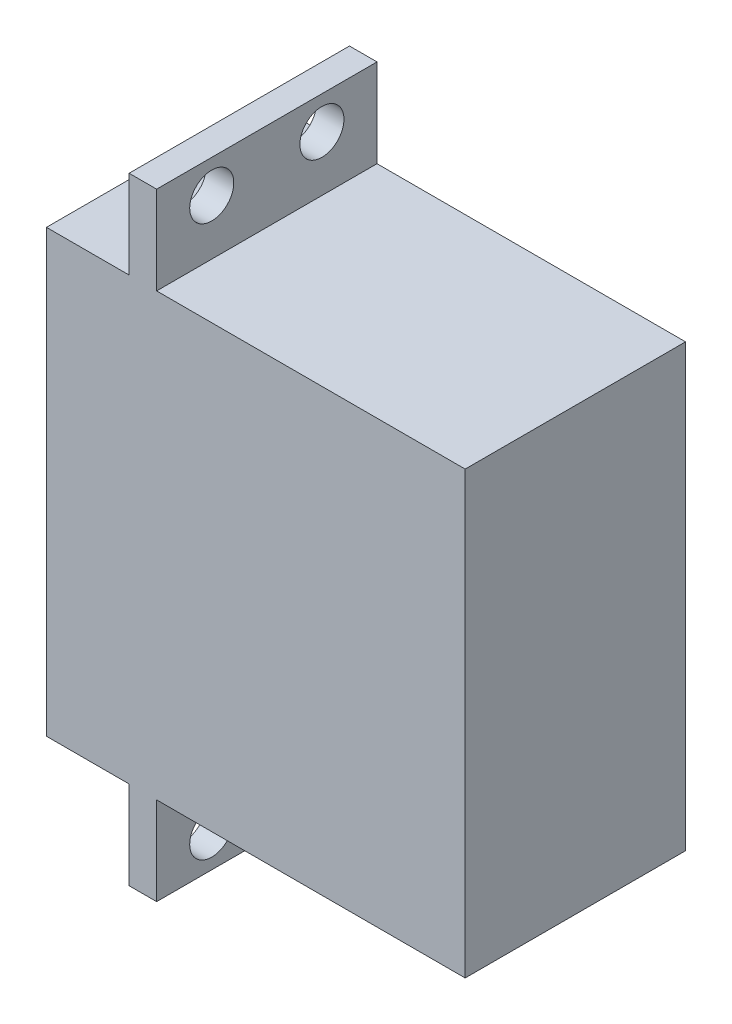
ISO-10303-21;
HEADER;
FILE_DESCRIPTION(('STEP AP214'),'2;1');
FILE_NAME('part.step','',(''),(''),'','','');
FILE_SCHEMA(('AUTOMOTIVE_DESIGN { 1 0 10303 214 1 1 1 1 }'));
ENDSEC;
DATA;
#1=APPLICATION_CONTEXT('core data for automotive mechanical design processes');
#2=APPLICATION_PROTOCOL_DEFINITION('international standard','automotive_design',2000,#1);
#3=PRODUCT_CONTEXT('',#1,'mechanical');
#4=PRODUCT('Part','Part','',(#3));
#5=PRODUCT_RELATED_PRODUCT_CATEGORY('part','',(#4));
#6=PRODUCT_DEFINITION_FORMATION('','',#4);
#7=PRODUCT_DEFINITION_CONTEXT('part definition',#1,'design');
#8=PRODUCT_DEFINITION('design','',#6,#7);
#9=PRODUCT_DEFINITION_SHAPE('','',#8);
#10=(LENGTH_UNIT() NAMED_UNIT(*) SI_UNIT(.MILLI.,.METRE.));
#11=(NAMED_UNIT(*) PLANE_ANGLE_UNIT() SI_UNIT($,.RADIAN.));
#12=(NAMED_UNIT(*) SI_UNIT($,.STERADIAN.) SOLID_ANGLE_UNIT());
#13=UNCERTAINTY_MEASURE_WITH_UNIT(LENGTH_MEASURE(1.E-05),#10,'distance_accuracy_value','');
#14=(GEOMETRIC_REPRESENTATION_CONTEXT(3) GLOBAL_UNCERTAINTY_ASSIGNED_CONTEXT((#13)) GLOBAL_UNIT_ASSIGNED_CONTEXT((#10,
#11,#12)) REPRESENTATION_CONTEXT('',''));
#15=CARTESIAN_POINT('',(0.,0.,0.));
#16=DIRECTION('',(0.,0.,1.));
#17=DIRECTION('',(1.,0.,0.));
#18=AXIS2_PLACEMENT_3D('',#15,#16,#17);
#19=CARTESIAN_POINT('',(-6.,10.,10.));
#20=DIRECTION('',(-1.,0.,0.));
#21=DIRECTION('',(0.,0.,1.));
#22=AXIS2_PLACEMENT_3D('',#19,#20,#21);
#23=PLANE('',#22);
#24=CARTESIAN_POINT('',(-6.,10.,10.));
#25=DIRECTION('',(1.,0.,0.));
#26=DIRECTION('',(0.,0.,-1.));
#27=AXIS2_PLACEMENT_3D('',#24,#25,#26);
#28=CIRCLE('',#27,3.);
#29=CARTESIAN_POINT('',(-6.,10.,7.));
#30=VERTEX_POINT('',#29);
#31=EDGE_CURVE('E20',#30,#30,#28,.T.);
#32=ORIENTED_EDGE('',*,*,#31,.F.);
#33=EDGE_LOOP('',(#32));
#34=FACE_BOUND('',#33,.T.);
#35=ADVANCED_FACE('F17',(#34),#23,.T.);
#36=CARTESIAN_POINT('',(-6.,10.,10.));
#37=DIRECTION('',(1.,0.,0.));
#38=DIRECTION('',(0.,0.,-1.));
#39=AXIS2_PLACEMENT_3D('',#36,#37,#38);
#40=CYLINDRICAL_SURFACE('',#39,3.);
#41=CARTESIAN_POINT('',(-2.,10.,10.));
#42=DIRECTION('',(1.,0.,0.));
#43=DIRECTION('',(0.,0.,-1.));
#44=AXIS2_PLACEMENT_3D('',#41,#42,#43);
#45=CIRCLE('',#44,3.);
#46=CARTESIAN_POINT('',(-2.,10.,7.));
#47=VERTEX_POINT('',#46);
#48=EDGE_CURVE('E168',#47,#47,#45,.T.);
#49=ORIENTED_EDGE('',*,*,#48,.F.);
#50=EDGE_LOOP('',(#49));
#51=FACE_BOUND('',#50,.T.);
#52=ORIENTED_EDGE('',*,*,#31,.T.);
#53=EDGE_LOOP('',(#52));
#54=FACE_BOUND('',#53,.T.);
#55=ADVANCED_FACE('F175',(#51,#54),#40,.T.);
#56=CARTESIAN_POINT('',(-2.,10.,10.));
#57=DIRECTION('',(-1.,0.,0.));
#58=DIRECTION('',(0.,0.,1.));
#59=AXIS2_PLACEMENT_3D('',#56,#57,#58);
#60=PLANE('',#59);
#61=ORIENTED_EDGE('',*,*,#48,.T.);
#62=EDGE_LOOP('',(#61));
#63=FACE_BOUND('',#62,.T.);
#64=CARTESIAN_POINT('',(-2.00000000000955,10.,10.));
#65=DIRECTION('',(1.,0.,0.));
#66=DIRECTION('',(0.,0.,-1.));
#67=AXIS2_PLACEMENT_3D('',#64,#65,#66);
#68=CIRCLE('',#67,4.9999999999477);
#69=CARTESIAN_POINT('',(-2.00000000000955,10.,5.0000000000523));
#70=VERTEX_POINT('',#69);
#71=EDGE_CURVE('E118',#70,#70,#68,.T.);
#72=ORIENTED_EDGE('',*,*,#71,.F.);
#73=EDGE_LOOP('',(#72));
#74=FACE_BOUND('',#73,.T.);
#75=ADVANCED_FACE('F182',(#63,#74),#60,.T.);
#76=CARTESIAN_POINT('',(11.5,-5.,15.0000000000005));
#77=DIRECTION('',(-1.,0.,0.));
#78=DIRECTION('',(0.,0.,1.));
#79=AXIS2_PLACEMENT_3D('',#76,#77,#78);
#80=CYLINDRICAL_SURFACE('',#79,2.);
#81=CARTESIAN_POINT('',(10.,-5.,15.0000000000005));
#82=DIRECTION('',(-1.,0.,0.));
#83=DIRECTION('',(0.,0.,1.));
#84=AXIS2_PLACEMENT_3D('',#81,#82,#83);
#85=CIRCLE('',#84,2.);
#86=CARTESIAN_POINT('',(10.,-5.,17.0000000000005));
#87=VERTEX_POINT('',#86);
#88=EDGE_CURVE('E162',#87,#87,#85,.T.);
#89=ORIENTED_EDGE('',*,*,#88,.F.);
#90=EDGE_LOOP('',(#89));
#91=FACE_BOUND('',#90,.T.);
#92=CARTESIAN_POINT('',(7.50000000000001,-5.,15.0000000000005));
#93=DIRECTION('',(-1.,0.,0.));
#94=DIRECTION('',(0.,0.,1.));
#95=AXIS2_PLACEMENT_3D('',#92,#93,#94);
#96=CIRCLE('',#95,2.);
#97=CARTESIAN_POINT('',(7.50000000000001,-5.,17.0000000000005));
#98=VERTEX_POINT('',#97);
#99=EDGE_CURVE('E117',#98,#98,#96,.T.);
#100=ORIENTED_EDGE('',*,*,#99,.T.);
#101=EDGE_LOOP('',(#100));
#102=FACE_BOUND('',#101,.T.);
#103=ADVANCED_FACE('F252',(#91,#102),#80,.F.);
#104=CARTESIAN_POINT('',(11.5,-5.,4.99999999999948));
#105=DIRECTION('',(-1.,0.,0.));
#106=DIRECTION('',(0.,0.,1.));
#107=AXIS2_PLACEMENT_3D('',#104,#105,#106);
#108=CYLINDRICAL_SURFACE('',#107,2.000000000001);
#109=CARTESIAN_POINT('',(10.,-5.,4.99999999999948));
#110=DIRECTION('',(-1.,0.,0.));
#111=DIRECTION('',(0.,0.,1.));
#112=AXIS2_PLACEMENT_3D('',#109,#110,#111);
#113=CIRCLE('',#112,2.000000000001);
#114=CARTESIAN_POINT('',(10.,-5.,7.00000000000047));
#115=VERTEX_POINT('',#114);
#116=EDGE_CURVE('E158',#115,#115,#113,.T.);
#117=ORIENTED_EDGE('',*,*,#116,.F.);
#118=EDGE_LOOP('',(#117));
#119=FACE_BOUND('',#118,.T.);
#120=CARTESIAN_POINT('',(7.50000000000001,-5.,4.99999999999948));
#121=DIRECTION('',(-1.,0.,0.));
#122=DIRECTION('',(0.,0.,1.));
#123=AXIS2_PLACEMENT_3D('',#120,#121,#122);
#124=CIRCLE('',#123,2.000000000001);
#125=CARTESIAN_POINT('',(7.50000000000001,-5.,7.00000000000047));
#126=VERTEX_POINT('',#125);
#127=EDGE_CURVE('E131',#126,#126,#124,.T.);
#128=ORIENTED_EDGE('',*,*,#127,.T.);
#129=EDGE_LOOP('',(#128));
#130=FACE_BOUND('',#129,.T.);
#131=ADVANCED_FACE('F248',(#119,#130),#108,.F.);
#132=CARTESIAN_POINT('',(11.5,45.,15.));
#133=DIRECTION('',(-1.,0.,0.));
#134=DIRECTION('',(0.,0.,1.));
#135=AXIS2_PLACEMENT_3D('',#132,#133,#134);
#136=CYLINDRICAL_SURFACE('',#135,2.);
#137=CARTESIAN_POINT('',(10.,45.,15.));
#138=DIRECTION('',(-1.,0.,0.));
#139=DIRECTION('',(0.,0.,1.));
#140=AXIS2_PLACEMENT_3D('',#137,#138,#139);
#141=CIRCLE('',#140,2.);
#142=CARTESIAN_POINT('',(10.,45.,17.));
#143=VERTEX_POINT('',#142);
#144=EDGE_CURVE('E154',#143,#143,#141,.T.);
#145=ORIENTED_EDGE('',*,*,#144,.F.);
#146=EDGE_LOOP('',(#145));
#147=FACE_BOUND('',#146,.T.);
#148=CARTESIAN_POINT('',(7.50000000000001,45.,15.));
#149=DIRECTION('',(-1.,0.,0.));
#150=DIRECTION('',(0.,0.,1.));
#151=AXIS2_PLACEMENT_3D('',#148,#149,#150);
#152=CIRCLE('',#151,2.);
#153=CARTESIAN_POINT('',(7.50000000000001,45.,17.));
#154=VERTEX_POINT('',#153);
#155=EDGE_CURVE('E146',#154,#154,#152,.T.);
#156=ORIENTED_EDGE('',*,*,#155,.T.);
#157=EDGE_LOOP('',(#156));
#158=FACE_BOUND('',#157,.T.);
#159=ADVANCED_FACE('F244',(#147,#158),#136,.F.);
#160=CARTESIAN_POINT('',(11.5,45.,4.99999999999999));
#161=DIRECTION('',(-1.,0.,0.));
#162=DIRECTION('',(0.,0.,1.));
#163=AXIS2_PLACEMENT_3D('',#160,#161,#162);
#164=CYLINDRICAL_SURFACE('',#163,2.);
#165=CARTESIAN_POINT('',(10.,45.,4.99999999999999));
#166=DIRECTION('',(-1.,0.,0.));
#167=DIRECTION('',(0.,0.,1.));
#168=AXIS2_PLACEMENT_3D('',#165,#166,#167);
#169=CIRCLE('',#168,2.);
#170=CARTESIAN_POINT('',(10.,45.,7.));
#171=VERTEX_POINT('',#170);
#172=EDGE_CURVE('E150',#171,#171,#169,.T.);
#173=ORIENTED_EDGE('',*,*,#172,.F.);
#174=EDGE_LOOP('',(#173));
#175=FACE_BOUND('',#174,.T.);
#176=CARTESIAN_POINT('',(7.50000000000001,45.,4.99999999999999));
#177=DIRECTION('',(-1.,0.,0.));
#178=DIRECTION('',(0.,0.,1.));
#179=AXIS2_PLACEMENT_3D('',#176,#177,#178);
#180=CIRCLE('',#179,2.);
#181=CARTESIAN_POINT('',(7.50000000000001,45.,7.));
#182=VERTEX_POINT('',#181);
#183=EDGE_CURVE('E142',#182,#182,#180,.T.);
#184=ORIENTED_EDGE('',*,*,#183,.T.);
#185=EDGE_LOOP('',(#184));
#186=FACE_BOUND('',#185,.T.);
#187=ADVANCED_FACE('F240',(#175,#186),#164,.F.);
#188=CARTESIAN_POINT('',(0.,10.,10.));
#189=DIRECTION('',(1.,0.,0.));
#190=DIRECTION('',(0.,0.,-1.));
#191=AXIS2_PLACEMENT_3D('',#188,#189,#190);
#192=CONICAL_SURFACE('',#191,6.99999999995725,0.785398163397448);
#193=CARTESIAN_POINT('',(0.,10.,10.));
#194=DIRECTION('',(1.,0.,0.));
#195=DIRECTION('',(0.,0.,-1.));
#196=AXIS2_PLACEMENT_3D('',#193,#194,#195);
#197=CIRCLE('',#196,6.99999999995725);
#198=CARTESIAN_POINT('',(0.,10.,3.00000000004275));
#199=VERTEX_POINT('',#198);
#200=EDGE_CURVE('E137',#199,#199,#197,.T.);
#201=ORIENTED_EDGE('',*,*,#200,.F.);
#202=EDGE_LOOP('',(#201));
#203=FACE_BOUND('',#202,.T.);
#204=ORIENTED_EDGE('',*,*,#71,.T.);
#205=EDGE_LOOP('',(#204));
#206=FACE_BOUND('',#205,.T.);
#207=ADVANCED_FACE('F237',(#203,#206),#192,.T.);
#208=CARTESIAN_POINT('',(0.,0.,0.));
#209=DIRECTION('',(0.,0.,1.));
#210=DIRECTION('',(1.,0.,0.));
#211=AXIS2_PLACEMENT_3D('',#208,#209,#210);
#212=PLANE('',#211);
#213=DIRECTION('',(0.,1.,0.));
#214=VECTOR('',#213,1.);
#215=CARTESIAN_POINT('',(0.,0.,0.));
#216=LINE('',#215,#214);
#217=CARTESIAN_POINT('',(0.,40.,0.));
#218=VERTEX_POINT('',#217);
#219=CARTESIAN_POINT('',(0.,0.,0.));
#220=VERTEX_POINT('',#219);
#221=EDGE_CURVE('E140',#218,#220,#216,.F.);
#222=ORIENTED_EDGE('',*,*,#221,.F.);
#223=DIRECTION('',(1.,0.,0.));
#224=VECTOR('',#223,1.);
#225=CARTESIAN_POINT('',(0.,40.,0.));
#226=LINE('',#225,#224);
#227=CARTESIAN_POINT('',(7.50000000000001,40.,0.));
#228=VERTEX_POINT('',#227);
#229=EDGE_CURVE('E443',#228,#218,#226,.F.);
#230=ORIENTED_EDGE('',*,*,#229,.F.);
#231=DIRECTION('',(0.,1.,0.));
#232=VECTOR('',#231,1.);
#233=CARTESIAN_POINT('',(7.50000000000001,0.,0.));
#234=LINE('',#233,#232);
#235=CARTESIAN_POINT('',(7.50000000000001,48.,0.));
#236=VERTEX_POINT('',#235);
#237=EDGE_CURVE('E445',#228,#236,#234,.T.);
#238=ORIENTED_EDGE('',*,*,#237,.T.);
#239=DIRECTION('',(-1.,0.,0.));
#240=VECTOR('',#239,1.);
#241=CARTESIAN_POINT('',(-1.33226762955019E-13,48.,0.));
#242=LINE('',#241,#240);
#243=CARTESIAN_POINT('',(10.,48.,0.));
#244=VERTEX_POINT('',#243);
#245=EDGE_CURVE('E451',#244,#236,#242,.T.);
#246=ORIENTED_EDGE('',*,*,#245,.F.);
#247=DIRECTION('',(0.,1.,0.));
#248=VECTOR('',#247,1.);
#249=CARTESIAN_POINT('',(10.,0.,0.));
#250=LINE('',#249,#248);
#251=CARTESIAN_POINT('',(10.,40.,0.));
#252=VERTEX_POINT('',#251);
#253=EDGE_CURVE('E153',#252,#244,#250,.T.);
#254=ORIENTED_EDGE('',*,*,#253,.F.);
#255=DIRECTION('',(1.,0.,0.));
#256=VECTOR('',#255,1.);
#257=CARTESIAN_POINT('',(0.,40.,0.));
#258=LINE('',#257,#256);
#259=CARTESIAN_POINT('',(38.,40.,0.));
#260=VERTEX_POINT('',#259);
#261=EDGE_CURVE('E460',#260,#252,#258,.F.);
#262=ORIENTED_EDGE('',*,*,#261,.F.);
#263=DIRECTION('',(0.,1.,0.));
#264=VECTOR('',#263,1.);
#265=CARTESIAN_POINT('',(38.,0.,0.));
#266=LINE('',#265,#264);
#267=CARTESIAN_POINT('',(38.,0.,0.));
#268=VERTEX_POINT('',#267);
#269=EDGE_CURVE('E463',#260,#268,#266,.F.);
#270=ORIENTED_EDGE('',*,*,#269,.T.);
#271=DIRECTION('',(1.,0.,0.));
#272=VECTOR('',#271,1.);
#273=CARTESIAN_POINT('',(0.,0.,0.));
#274=LINE('',#273,#272);
#275=CARTESIAN_POINT('',(10.,0.,0.));
#276=VERTEX_POINT('',#275);
#277=EDGE_CURVE('E468',#268,#276,#274,.F.);
#278=ORIENTED_EDGE('',*,*,#277,.T.);
#279=DIRECTION('',(0.,1.,0.));
#280=VECTOR('',#279,1.);
#281=CARTESIAN_POINT('',(10.,0.,0.));
#282=LINE('',#281,#280);
#283=CARTESIAN_POINT('',(10.,-8.,0.));
#284=VERTEX_POINT('',#283);
#285=EDGE_CURVE('E161',#284,#276,#282,.T.);
#286=ORIENTED_EDGE('',*,*,#285,.F.);
#287=DIRECTION('',(-1.,0.,0.));
#288=VECTOR('',#287,1.);
#289=CARTESIAN_POINT('',(0.,-7.99999999999997,0.));
#290=LINE('',#289,#288);
#291=CARTESIAN_POINT('',(7.50000000000001,-7.99999999999999,0.));
#292=VERTEX_POINT('',#291);
#293=EDGE_CURVE('E122',#284,#292,#290,.T.);
#294=ORIENTED_EDGE('',*,*,#293,.T.);
#295=DIRECTION('',(0.,1.,0.));
#296=VECTOR('',#295,1.);
#297=CARTESIAN_POINT('',(7.50000000000001,0.,0.));
#298=LINE('',#297,#296);
#299=CARTESIAN_POINT('',(7.50000000000001,0.,0.));
#300=VERTEX_POINT('',#299);
#301=EDGE_CURVE('E104',#292,#300,#298,.T.);
#302=ORIENTED_EDGE('',*,*,#301,.T.);
#303=DIRECTION('',(1.,0.,0.));
#304=VECTOR('',#303,1.);
#305=CARTESIAN_POINT('',(0.,0.,0.));
#306=LINE('',#305,#304);
#307=EDGE_CURVE('E109',#300,#220,#306,.F.);
#308=ORIENTED_EDGE('',*,*,#307,.T.);
#309=EDGE_LOOP('',(#222,#230,#238,#246,#254,#262,#270,#278,#286,#294,#302,#308));
#310=FACE_BOUND('',#309,.T.);
#311=ADVANCED_FACE('F120',(#310),#212,.F.);
#312=CARTESIAN_POINT('',(0.,0.,20.));
#313=DIRECTION('',(0.,1.,0.));
#314=DIRECTION('',(0.,0.,1.));
#315=AXIS2_PLACEMENT_3D('',#312,#313,#314);
#316=PLANE('',#315);
#317=DIRECTION('',(0.,0.,-1.));
#318=VECTOR('',#317,1.);
#319=CARTESIAN_POINT('',(7.50000000000001,0.,20.));
#320=LINE('',#319,#318);
#321=CARTESIAN_POINT('',(7.50000000000001,0.,20.));
#322=VERTEX_POINT('',#321);
#323=EDGE_CURVE('E111',#300,#322,#320,.F.);
#324=ORIENTED_EDGE('',*,*,#323,.T.);
#325=DIRECTION('',(1.,0.,0.));
#326=VECTOR('',#325,1.);
#327=CARTESIAN_POINT('',(0.,0.,20.));
#328=LINE('',#327,#326);
#329=CARTESIAN_POINT('',(0.,0.,20.));
#330=VERTEX_POINT('',#329);
#331=EDGE_CURVE('E433',#330,#322,#328,.T.);
#332=ORIENTED_EDGE('',*,*,#331,.F.);
#333=DIRECTION('',(0.,0.,1.));
#334=VECTOR('',#333,1.);
#335=CARTESIAN_POINT('',(0.,0.,20.));
#336=LINE('',#335,#334);
#337=EDGE_CURVE('E114',#220,#330,#336,.T.);
#338=ORIENTED_EDGE('',*,*,#337,.F.);
#339=ORIENTED_EDGE('',*,*,#307,.F.);
#340=EDGE_LOOP('',(#324,#332,#338,#339));
#341=FACE_BOUND('',#340,.T.);
#342=ADVANCED_FACE('F110',(#341),#316,.F.);
#343=CARTESIAN_POINT('',(7.50000000000001,0.,20.));
#344=DIRECTION('',(1.,0.,0.));
#345=DIRECTION('',(0.,0.,-1.));
#346=AXIS2_PLACEMENT_3D('',#343,#344,#345);
#347=PLANE('',#346);
#348=DIRECTION('',(0.,0.,1.));
#349=VECTOR('',#348,1.);
#350=CARTESIAN_POINT('',(7.50000000000001,-7.99999999999999,20.));
#351=LINE('',#350,#349);
#352=CARTESIAN_POINT('',(7.50000000000001,-7.99999999999999,20.));
#353=VERTEX_POINT('',#352);
#354=EDGE_CURVE('E124',#292,#353,#351,.T.);
#355=ORIENTED_EDGE('',*,*,#354,.T.);
#356=DIRECTION('',(0.,1.,0.));
#357=VECTOR('',#356,1.);
#358=CARTESIAN_POINT('',(7.50000000000001,0.,20.));
#359=LINE('',#358,#357);
#360=EDGE_CURVE('E129',#322,#353,#359,.F.);
#361=ORIENTED_EDGE('',*,*,#360,.F.);
#362=ORIENTED_EDGE('',*,*,#323,.F.);
#363=ORIENTED_EDGE('',*,*,#301,.F.);
#364=EDGE_LOOP('',(#355,#361,#362,#363));
#365=FACE_BOUND('',#364,.T.);
#366=ORIENTED_EDGE('',*,*,#127,.F.);
#367=EDGE_LOOP('',(#366));
#368=FACE_BOUND('',#367,.T.);
#369=ORIENTED_EDGE('',*,*,#99,.F.);
#370=EDGE_LOOP('',(#369));
#371=FACE_BOUND('',#370,.T.);
#372=ADVANCED_FACE('F126',(#365,#368,#371),#347,.F.);
#373=CARTESIAN_POINT('',(0.,-7.99999999999997,20.));
#374=DIRECTION('',(0.,1.,0.));
#375=DIRECTION('',(-1.,0.,0.));
#376=AXIS2_PLACEMENT_3D('',#373,#374,#375);
#377=PLANE('',#376);
#378=DIRECTION('',(0.,0.,-1.));
#379=VECTOR('',#378,1.);
#380=CARTESIAN_POINT('',(10.,-8.,20.));
#381=LINE('',#380,#379);
#382=CARTESIAN_POINT('',(10.,-8.,20.));
#383=VERTEX_POINT('',#382);
#384=EDGE_CURVE('E419',#383,#284,#381,.T.);
#385=ORIENTED_EDGE('',*,*,#384,.F.);
#386=DIRECTION('',(1.,0.,0.));
#387=VECTOR('',#386,1.);
#388=CARTESIAN_POINT('',(0.,-7.99999999999999,20.));
#389=LINE('',#388,#387);
#390=EDGE_CURVE('E422',#353,#383,#389,.T.);
#391=ORIENTED_EDGE('',*,*,#390,.F.);
#392=ORIENTED_EDGE('',*,*,#354,.F.);
#393=ORIENTED_EDGE('',*,*,#293,.F.);
#394=EDGE_LOOP('',(#385,#391,#392,#393));
#395=FACE_BOUND('',#394,.T.);
#396=ADVANCED_FACE('F226',(#395),#377,.F.);
#397=CARTESIAN_POINT('',(10.,0.,20.));
#398=DIRECTION('',(1.,0.,0.));
#399=DIRECTION('',(0.,0.,-1.));
#400=AXIS2_PLACEMENT_3D('',#397,#398,#399);
#401=PLANE('',#400);
#402=DIRECTION('',(0.,1.,0.));
#403=VECTOR('',#402,1.);
#404=CARTESIAN_POINT('',(10.,0.,20.));
#405=LINE('',#404,#403);
#406=CARTESIAN_POINT('',(10.,0.,20.));
#407=VERTEX_POINT('',#406);
#408=EDGE_CURVE('E426',#383,#407,#405,.T.);
#409=ORIENTED_EDGE('',*,*,#408,.F.);
#410=ORIENTED_EDGE('',*,*,#384,.T.);
#411=ORIENTED_EDGE('',*,*,#285,.T.);
#412=DIRECTION('',(0.,0.,1.));
#413=VECTOR('',#412,1.);
#414=CARTESIAN_POINT('',(10.,0.,20.));
#415=LINE('',#414,#413);
#416=EDGE_CURVE('E423',#276,#407,#415,.T.);
#417=ORIENTED_EDGE('',*,*,#416,.T.);
#418=EDGE_LOOP('',(#409,#410,#411,#417));
#419=FACE_BOUND('',#418,.T.);
#420=ORIENTED_EDGE('',*,*,#116,.T.);
#421=EDGE_LOOP('',(#420));
#422=FACE_BOUND('',#421,.T.);
#423=ORIENTED_EDGE('',*,*,#88,.T.);
#424=EDGE_LOOP('',(#423));
#425=FACE_BOUND('',#424,.T.);
#426=ADVANCED_FACE('F222',(#419,#422,#425),#401,.T.);
#427=CARTESIAN_POINT('',(0.,0.,20.));
#428=DIRECTION('',(0.,1.,0.));
#429=DIRECTION('',(0.,0.,1.));
#430=AXIS2_PLACEMENT_3D('',#427,#428,#429);
#431=PLANE('',#430);
#432=DIRECTION('',(0.,0.,1.));
#433=VECTOR('',#432,1.);
#434=CARTESIAN_POINT('',(38.,0.,20.));
#435=LINE('',#434,#433);
#436=CARTESIAN_POINT('',(38.,0.,20.));
#437=VERTEX_POINT('',#436);
#438=EDGE_CURVE('E466',#268,#437,#435,.T.);
#439=ORIENTED_EDGE('',*,*,#438,.T.);
#440=DIRECTION('',(1.,0.,0.));
#441=VECTOR('',#440,1.);
#442=CARTESIAN_POINT('',(0.,0.,20.));
#443=LINE('',#442,#441);
#444=EDGE_CURVE('E430',#407,#437,#443,.T.);
#445=ORIENTED_EDGE('',*,*,#444,.F.);
#446=ORIENTED_EDGE('',*,*,#416,.F.);
#447=ORIENTED_EDGE('',*,*,#277,.F.);
#448=EDGE_LOOP('',(#439,#445,#446,#447));
#449=FACE_BOUND('',#448,.T.);
#450=ADVANCED_FACE('F218',(#449),#431,.F.);
#451=CARTESIAN_POINT('',(38.,0.,20.));
#452=DIRECTION('',(-1.,0.,0.));
#453=DIRECTION('',(0.,0.,1.));
#454=AXIS2_PLACEMENT_3D('',#451,#452,#453);
#455=PLANE('',#454);
#456=DIRECTION('',(0.,0.,1.));
#457=VECTOR('',#456,1.);
#458=CARTESIAN_POINT('',(38.,40.,20.));
#459=LINE('',#458,#457);
#460=CARTESIAN_POINT('',(38.,40.,20.));
#461=VERTEX_POINT('',#460);
#462=EDGE_CURVE('E157',#461,#260,#459,.F.);
#463=ORIENTED_EDGE('',*,*,#462,.F.);
#464=DIRECTION('',(0.,1.,0.));
#465=VECTOR('',#464,1.);
#466=CARTESIAN_POINT('',(38.,0.,20.));
#467=LINE('',#466,#465);
#468=EDGE_CURVE('E477',#437,#461,#467,.T.);
#469=ORIENTED_EDGE('',*,*,#468,.F.);
#470=ORIENTED_EDGE('',*,*,#438,.F.);
#471=ORIENTED_EDGE('',*,*,#269,.F.);
#472=EDGE_LOOP('',(#463,#469,#470,#471));
#473=FACE_BOUND('',#472,.T.);
#474=ADVANCED_FACE('F214',(#473),#455,.F.);
#475=CARTESIAN_POINT('',(0.,40.,20.));
#476=DIRECTION('',(0.,1.,0.));
#477=DIRECTION('',(0.,0.,1.));
#478=AXIS2_PLACEMENT_3D('',#475,#476,#477);
#479=PLANE('',#478);
#480=DIRECTION('',(1.,0.,0.));
#481=VECTOR('',#480,1.);
#482=CARTESIAN_POINT('',(0.,40.,20.));
#483=LINE('',#482,#481);
#484=CARTESIAN_POINT('',(10.,40.,20.));
#485=VERTEX_POINT('',#484);
#486=EDGE_CURVE('E478',#461,#485,#483,.F.);
#487=ORIENTED_EDGE('',*,*,#486,.F.);
#488=ORIENTED_EDGE('',*,*,#462,.T.);
#489=ORIENTED_EDGE('',*,*,#261,.T.);
#490=DIRECTION('',(0.,0.,-1.));
#491=VECTOR('',#490,1.);
#492=CARTESIAN_POINT('',(10.,40.,20.));
#493=LINE('',#492,#491);
#494=EDGE_CURVE('E453',#485,#252,#493,.T.);
#495=ORIENTED_EDGE('',*,*,#494,.F.);
#496=EDGE_LOOP('',(#487,#488,#489,#495));
#497=FACE_BOUND('',#496,.T.);
#498=ADVANCED_FACE('F210',(#497),#479,.T.);
#499=CARTESIAN_POINT('',(10.,0.,20.));
#500=DIRECTION('',(1.,0.,0.));
#501=DIRECTION('',(0.,0.,-1.));
#502=AXIS2_PLACEMENT_3D('',#499,#500,#501);
#503=PLANE('',#502);
#504=DIRECTION('',(0.,1.,0.));
#505=VECTOR('',#504,1.);
#506=CARTESIAN_POINT('',(10.,0.,20.));
#507=LINE('',#506,#505);
#508=CARTESIAN_POINT('',(10.,48.,20.));
#509=VERTEX_POINT('',#508);
#510=EDGE_CURVE('E483',#485,#509,#507,.T.);
#511=ORIENTED_EDGE('',*,*,#510,.F.);
#512=ORIENTED_EDGE('',*,*,#494,.T.);
#513=ORIENTED_EDGE('',*,*,#253,.T.);
#514=DIRECTION('',(0.,0.,1.));
#515=VECTOR('',#514,1.);
#516=CARTESIAN_POINT('',(10.,48.,20.));
#517=LINE('',#516,#515);
#518=EDGE_CURVE('E149',#509,#244,#517,.F.);
#519=ORIENTED_EDGE('',*,*,#518,.F.);
#520=EDGE_LOOP('',(#511,#512,#513,#519));
#521=FACE_BOUND('',#520,.T.);
#522=ORIENTED_EDGE('',*,*,#172,.T.);
#523=EDGE_LOOP('',(#522));
#524=FACE_BOUND('',#523,.T.);
#525=ORIENTED_EDGE('',*,*,#144,.T.);
#526=EDGE_LOOP('',(#525));
#527=FACE_BOUND('',#526,.T.);
#528=ADVANCED_FACE('F206',(#521,#524,#527),#503,.T.);
#529=CARTESIAN_POINT('',(-1.33226762955019E-13,48.,20.));
#530=DIRECTION('',(0.,1.,0.));
#531=DIRECTION('',(-1.,0.,0.));
#532=AXIS2_PLACEMENT_3D('',#529,#530,#531);
#533=PLANE('',#532);
#534=DIRECTION('',(1.,0.,0.));
#535=VECTOR('',#534,1.);
#536=CARTESIAN_POINT('',(0.,48.,20.));
#537=LINE('',#536,#535);
#538=CARTESIAN_POINT('',(7.50000000000001,48.,20.));
#539=VERTEX_POINT('',#538);
#540=EDGE_CURVE('E486',#509,#539,#537,.F.);
#541=ORIENTED_EDGE('',*,*,#540,.F.);
#542=ORIENTED_EDGE('',*,*,#518,.T.);
#543=ORIENTED_EDGE('',*,*,#245,.T.);
#544=DIRECTION('',(0.,0.,-1.));
#545=VECTOR('',#544,1.);
#546=CARTESIAN_POINT('',(7.50000000000001,48.,20.));
#547=LINE('',#546,#545);
#548=EDGE_CURVE('E145',#236,#539,#547,.F.);
#549=ORIENTED_EDGE('',*,*,#548,.T.);
#550=EDGE_LOOP('',(#541,#542,#543,#549));
#551=FACE_BOUND('',#550,.T.);
#552=ADVANCED_FACE('F202',(#551),#533,.T.);
#553=CARTESIAN_POINT('',(7.50000000000001,0.,20.));
#554=DIRECTION('',(1.,0.,0.));
#555=DIRECTION('',(0.,0.,-1.));
#556=AXIS2_PLACEMENT_3D('',#553,#554,#555);
#557=PLANE('',#556);
#558=DIRECTION('',(0.,0.,1.));
#559=VECTOR('',#558,1.);
#560=CARTESIAN_POINT('',(7.50000000000001,40.,20.));
#561=LINE('',#560,#559);
#562=CARTESIAN_POINT('',(7.50000000000001,40.,20.));
#563=VERTEX_POINT('',#562);
#564=EDGE_CURVE('E141',#563,#228,#561,.F.);
#565=ORIENTED_EDGE('',*,*,#564,.F.);
#566=DIRECTION('',(0.,1.,0.));
#567=VECTOR('',#566,1.);
#568=CARTESIAN_POINT('',(7.50000000000001,0.,20.));
#569=LINE('',#568,#567);
#570=EDGE_CURVE('E489',#539,#563,#569,.F.);
#571=ORIENTED_EDGE('',*,*,#570,.F.);
#572=ORIENTED_EDGE('',*,*,#548,.F.);
#573=ORIENTED_EDGE('',*,*,#237,.F.);
#574=EDGE_LOOP('',(#565,#571,#572,#573));
#575=FACE_BOUND('',#574,.T.);
#576=ORIENTED_EDGE('',*,*,#183,.F.);
#577=EDGE_LOOP('',(#576));
#578=FACE_BOUND('',#577,.T.);
#579=ORIENTED_EDGE('',*,*,#155,.F.);
#580=EDGE_LOOP('',(#579));
#581=FACE_BOUND('',#580,.T.);
#582=ADVANCED_FACE('F199',(#575,#578,#581),#557,.F.);
#583=CARTESIAN_POINT('',(0.,40.,20.));
#584=DIRECTION('',(0.,1.,0.));
#585=DIRECTION('',(0.,0.,1.));
#586=AXIS2_PLACEMENT_3D('',#583,#584,#585);
#587=PLANE('',#586);
#588=DIRECTION('',(1.,0.,0.));
#589=VECTOR('',#588,1.);
#590=CARTESIAN_POINT('',(0.,40.,20.));
#591=LINE('',#590,#589);
#592=CARTESIAN_POINT('',(0.,40.,20.));
#593=VERTEX_POINT('',#592);
#594=EDGE_CURVE('E26',#563,#593,#591,.F.);
#595=ORIENTED_EDGE('',*,*,#594,.F.);
#596=ORIENTED_EDGE('',*,*,#564,.T.);
#597=ORIENTED_EDGE('',*,*,#229,.T.);
#598=DIRECTION('',(0.,0.,1.));
#599=VECTOR('',#598,1.);
#600=CARTESIAN_POINT('',(0.,40.,20.));
#601=LINE('',#600,#599);
#602=EDGE_CURVE('E35',#593,#218,#601,.F.);
#603=ORIENTED_EDGE('',*,*,#602,.F.);
#604=EDGE_LOOP('',(#595,#596,#597,#603));
#605=FACE_BOUND('',#604,.T.);
#606=ADVANCED_FACE('F192',(#605),#587,.T.);
#607=CARTESIAN_POINT('',(0.,0.,20.));
#608=DIRECTION('',(-1.,0.,0.));
#609=DIRECTION('',(0.,0.,1.));
#610=AXIS2_PLACEMENT_3D('',#607,#608,#609);
#611=PLANE('',#610);
#612=DIRECTION('',(0.,1.,0.));
#613=VECTOR('',#612,1.);
#614=CARTESIAN_POINT('',(0.,0.,20.));
#615=LINE('',#614,#613);
#616=EDGE_CURVE('E11',#593,#330,#615,.F.);
#617=ORIENTED_EDGE('',*,*,#616,.F.);
#618=ORIENTED_EDGE('',*,*,#602,.T.);
#619=ORIENTED_EDGE('',*,*,#221,.T.);
#620=ORIENTED_EDGE('',*,*,#337,.T.);
#621=EDGE_LOOP('',(#617,#618,#619,#620));
#622=FACE_BOUND('',#621,.T.);
#623=ORIENTED_EDGE('',*,*,#200,.T.);
#624=EDGE_LOOP('',(#623));
#625=FACE_BOUND('',#624,.T.);
#626=ADVANCED_FACE('F186',(#622,#625),#611,.T.);
#627=CARTESIAN_POINT('',(0.,0.,20.));
#628=DIRECTION('',(0.,0.,1.));
#629=DIRECTION('',(1.,0.,0.));
#630=AXIS2_PLACEMENT_3D('',#627,#628,#629);
#631=PLANE('',#630);
#632=ORIENTED_EDGE('',*,*,#594,.T.);
#633=ORIENTED_EDGE('',*,*,#616,.T.);
#634=ORIENTED_EDGE('',*,*,#331,.T.);
#635=ORIENTED_EDGE('',*,*,#360,.T.);
#636=ORIENTED_EDGE('',*,*,#390,.T.);
#637=ORIENTED_EDGE('',*,*,#408,.T.);
#638=ORIENTED_EDGE('',*,*,#444,.T.);
#639=ORIENTED_EDGE('',*,*,#468,.T.);
#640=ORIENTED_EDGE('',*,*,#486,.T.);
#641=ORIENTED_EDGE('',*,*,#510,.T.);
#642=ORIENTED_EDGE('',*,*,#540,.T.);
#643=ORIENTED_EDGE('',*,*,#570,.T.);
#644=EDGE_LOOP('',(#632,#633,#634,#635,#636,#637,#638,#639,#640,#641,#642,#643));
#645=FACE_BOUND('',#644,.T.);
#646=ADVANCED_FACE('F184',(#645),#631,.T.);
#647=CLOSED_SHELL('',(#35,#55,#75,#103,#131,#159,#187,#207,#311,#342,#372,#396,#426,#450,#474,
#498,#528,#552,#582,#606,#626,#646));
#648=MANIFOLD_SOLID_BREP('B1',#647);
#649=ADVANCED_BREP_SHAPE_REPRESENTATION('',(#18,#648),#14);
#650=SHAPE_DEFINITION_REPRESENTATION(#9,#649);
ENDSEC;
END-ISO-10303-21;
